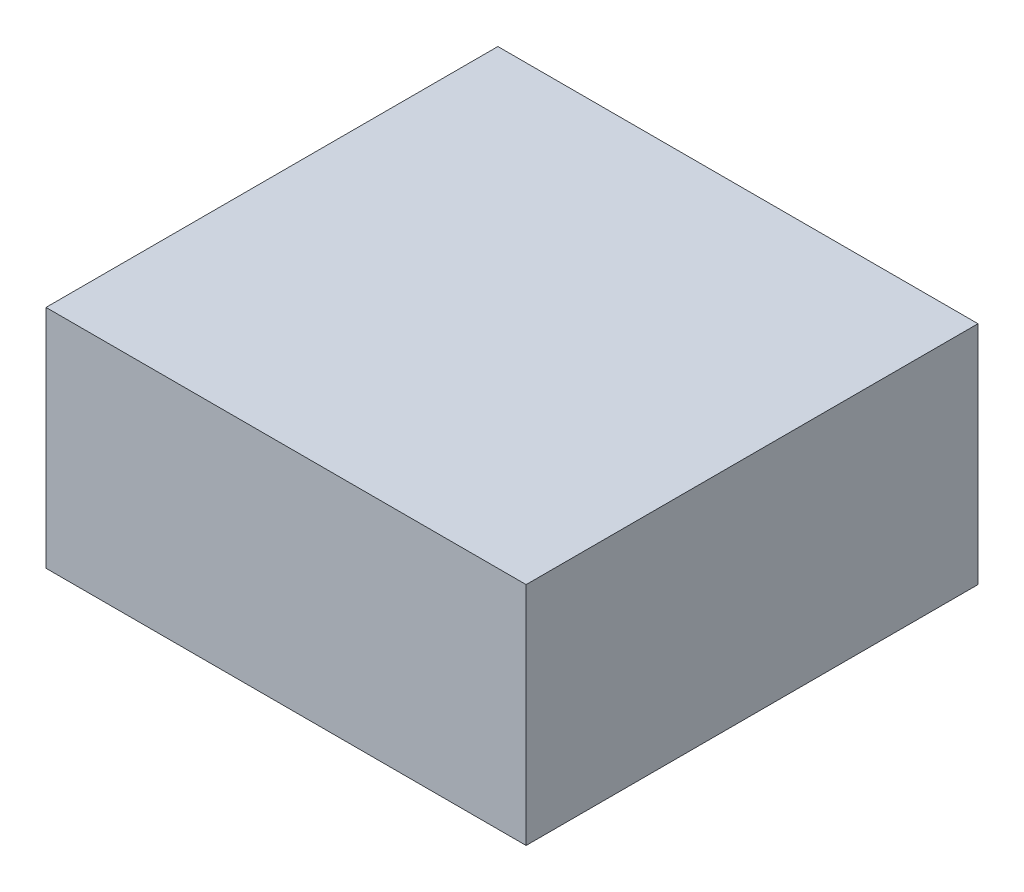
ISO-10303-21;
HEADER;
FILE_DESCRIPTION(('STEP AP214'),'2;1');
FILE_NAME('part.step','',(''),(''),'','','');
FILE_SCHEMA(('AUTOMOTIVE_DESIGN { 1 0 10303 214 1 1 1 1 }'));
ENDSEC;
DATA;
#1=APPLICATION_CONTEXT('core data for automotive mechanical design processes');
#2=APPLICATION_PROTOCOL_DEFINITION('international standard','automotive_design',2000,#1);
#3=PRODUCT_CONTEXT('',#1,'mechanical');
#4=PRODUCT('Part','Part','',(#3));
#5=PRODUCT_RELATED_PRODUCT_CATEGORY('part','',(#4));
#6=PRODUCT_DEFINITION_FORMATION('','',#4);
#7=PRODUCT_DEFINITION_CONTEXT('part definition',#1,'design');
#8=PRODUCT_DEFINITION('design','',#6,#7);
#9=PRODUCT_DEFINITION_SHAPE('','',#8);
#10=(LENGTH_UNIT() NAMED_UNIT(*) SI_UNIT(.MILLI.,.METRE.));
#11=(NAMED_UNIT(*) PLANE_ANGLE_UNIT() SI_UNIT($,.RADIAN.));
#12=(NAMED_UNIT(*) SI_UNIT($,.STERADIAN.) SOLID_ANGLE_UNIT());
#13=UNCERTAINTY_MEASURE_WITH_UNIT(LENGTH_MEASURE(1.E-05),#10,'distance_accuracy_value','');
#14=(GEOMETRIC_REPRESENTATION_CONTEXT(3) GLOBAL_UNCERTAINTY_ASSIGNED_CONTEXT((#13)) GLOBAL_UNIT_ASSIGNED_CONTEXT((#10,
#11,#12)) REPRESENTATION_CONTEXT('',''));
#15=CARTESIAN_POINT('',(0.,0.,0.));
#16=DIRECTION('',(0.,0.,1.));
#17=DIRECTION('',(1.,0.,0.));
#18=AXIS2_PLACEMENT_3D('',#15,#16,#17);
#19=CARTESIAN_POINT('',(-42.5,-20.,80.));
#20=DIRECTION('',(1.,0.,0.));
#21=DIRECTION('',(0.,0.,-1.));
#22=AXIS2_PLACEMENT_3D('',#19,#20,#21);
#23=PLANE('',#22);
#24=DIRECTION('',(0.,-1.,0.));
#25=VECTOR('',#24,1.);
#26=CARTESIAN_POINT('',(-42.5,-20.,0.));
#27=LINE('',#26,#25);
#28=CARTESIAN_POINT('',(-42.5,20.,0.));
#29=VERTEX_POINT('',#28);
#30=CARTESIAN_POINT('',(-42.5,-20.,0.));
#31=VERTEX_POINT('',#30);
#32=EDGE_CURVE('E104',#29,#31,#27,.T.);
#33=ORIENTED_EDGE('',*,*,#32,.T.);
#34=DIRECTION('',(0.,0.,-1.));
#35=VECTOR('',#34,1.);
#36=CARTESIAN_POINT('',(-42.5,-20.,80.));
#37=LINE('',#36,#35);
#38=CARTESIAN_POINT('',(-42.5,-20.,80.));
#39=VERTEX_POINT('',#38);
#40=EDGE_CURVE('E11',#39,#31,#37,.T.);
#41=ORIENTED_EDGE('',*,*,#40,.F.);
#42=DIRECTION('',(0.,-1.,0.));
#43=VECTOR('',#42,1.);
#44=CARTESIAN_POINT('',(-42.5,-20.,80.));
#45=LINE('',#44,#43);
#46=CARTESIAN_POINT('',(-42.5,20.,80.));
#47=VERTEX_POINT('',#46);
#48=EDGE_CURVE('E92',#47,#39,#45,.T.);
#49=ORIENTED_EDGE('',*,*,#48,.F.);
#50=DIRECTION('',(0.,0.,-1.));
#51=VECTOR('',#50,1.);
#52=CARTESIAN_POINT('',(-42.5,20.,80.));
#53=LINE('',#52,#51);
#54=EDGE_CURVE('E100',#47,#29,#53,.T.);
#55=ORIENTED_EDGE('',*,*,#54,.T.);
#56=EDGE_LOOP('',(#33,#41,#49,#55));
#57=FACE_BOUND('',#56,.T.);
#58=ADVANCED_FACE('F41',(#57),#23,.F.);
#59=CARTESIAN_POINT('',(-42.5,-20.,80.));
#60=DIRECTION('',(0.,1.,0.));
#61=DIRECTION('',(0.,0.,1.));
#62=AXIS2_PLACEMENT_3D('',#59,#60,#61);
#63=PLANE('',#62);
#64=DIRECTION('',(1.,0.,0.));
#65=VECTOR('',#64,1.);
#66=CARTESIAN_POINT('',(-42.5,-20.,0.));
#67=LINE('',#66,#65);
#68=CARTESIAN_POINT('',(42.5,-20.,0.));
#69=VERTEX_POINT('',#68);
#70=EDGE_CURVE('E96',#31,#69,#67,.T.);
#71=ORIENTED_EDGE('',*,*,#70,.T.);
#72=DIRECTION('',(0.,0.,-1.));
#73=VECTOR('',#72,1.);
#74=CARTESIAN_POINT('',(42.5,-20.,80.));
#75=LINE('',#74,#73);
#76=CARTESIAN_POINT('',(42.5,-20.,80.));
#77=VERTEX_POINT('',#76);
#78=EDGE_CURVE('E49',#77,#69,#75,.T.);
#79=ORIENTED_EDGE('',*,*,#78,.F.);
#80=DIRECTION('',(1.,0.,0.));
#81=VECTOR('',#80,1.);
#82=CARTESIAN_POINT('',(-42.5,-20.,80.));
#83=LINE('',#82,#81);
#84=EDGE_CURVE('E87',#39,#77,#83,.T.);
#85=ORIENTED_EDGE('',*,*,#84,.F.);
#86=ORIENTED_EDGE('',*,*,#40,.T.);
#87=EDGE_LOOP('',(#71,#79,#85,#86));
#88=FACE_BOUND('',#87,.T.);
#89=ADVANCED_FACE('F95',(#88),#63,.F.);
#90=CARTESIAN_POINT('',(42.5,-20.,80.));
#91=DIRECTION('',(-1.,0.,0.));
#92=DIRECTION('',(0.,0.,1.));
#93=AXIS2_PLACEMENT_3D('',#90,#91,#92);
#94=PLANE('',#93);
#95=DIRECTION('',(0.,1.,0.));
#96=VECTOR('',#95,1.);
#97=CARTESIAN_POINT('',(42.5,-20.,0.));
#98=LINE('',#97,#96);
#99=CARTESIAN_POINT('',(42.5,20.,0.));
#100=VERTEX_POINT('',#99);
#101=EDGE_CURVE('E74',#69,#100,#98,.T.);
#102=ORIENTED_EDGE('',*,*,#101,.T.);
#103=DIRECTION('',(0.,0.,-1.));
#104=VECTOR('',#103,1.);
#105=CARTESIAN_POINT('',(42.5,20.,80.));
#106=LINE('',#105,#104);
#107=CARTESIAN_POINT('',(42.5,20.,80.));
#108=VERTEX_POINT('',#107);
#109=EDGE_CURVE('E97',#108,#100,#106,.T.);
#110=ORIENTED_EDGE('',*,*,#109,.F.);
#111=DIRECTION('',(0.,1.,0.));
#112=VECTOR('',#111,1.);
#113=CARTESIAN_POINT('',(42.5,-20.,80.));
#114=LINE('',#113,#112);
#115=EDGE_CURVE('E90',#77,#108,#114,.T.);
#116=ORIENTED_EDGE('',*,*,#115,.F.);
#117=ORIENTED_EDGE('',*,*,#78,.T.);
#118=EDGE_LOOP('',(#102,#110,#116,#117));
#119=FACE_BOUND('',#118,.T.);
#120=ADVANCED_FACE('F98',(#119),#94,.F.);
#121=CARTESIAN_POINT('',(-42.5,20.,80.));
#122=DIRECTION('',(0.,-1.,0.));
#123=DIRECTION('',(0.,0.,-1.));
#124=AXIS2_PLACEMENT_3D('',#121,#122,#123);
#125=PLANE('',#124);
#126=DIRECTION('',(-1.,0.,0.));
#127=VECTOR('',#126,1.);
#128=CARTESIAN_POINT('',(-42.5,20.,0.));
#129=LINE('',#128,#127);
#130=EDGE_CURVE('E80',#100,#29,#129,.T.);
#131=ORIENTED_EDGE('',*,*,#130,.T.);
#132=ORIENTED_EDGE('',*,*,#54,.F.);
#133=DIRECTION('',(-1.,0.,0.));
#134=VECTOR('',#133,1.);
#135=CARTESIAN_POINT('',(-42.5,20.,80.));
#136=LINE('',#135,#134);
#137=EDGE_CURVE('E57',#108,#47,#136,.T.);
#138=ORIENTED_EDGE('',*,*,#137,.F.);
#139=ORIENTED_EDGE('',*,*,#109,.T.);
#140=EDGE_LOOP('',(#131,#132,#138,#139));
#141=FACE_BOUND('',#140,.T.);
#142=ADVANCED_FACE('F111',(#141),#125,.F.);
#143=CARTESIAN_POINT('',(0.,0.,80.));
#144=DIRECTION('',(0.,0.,-1.));
#145=DIRECTION('',(-1.,0.,0.));
#146=AXIS2_PLACEMENT_3D('',#143,#144,#145);
#147=PLANE('',#146);
#148=ORIENTED_EDGE('',*,*,#48,.T.);
#149=ORIENTED_EDGE('',*,*,#84,.T.);
#150=ORIENTED_EDGE('',*,*,#115,.T.);
#151=ORIENTED_EDGE('',*,*,#137,.T.);
#152=EDGE_LOOP('',(#148,#149,#150,#151));
#153=FACE_BOUND('',#152,.T.);
#154=ADVANCED_FACE('F88',(#153),#147,.F.);
#155=CARTESIAN_POINT('',(0.,0.,0.));
#156=DIRECTION('',(0.,0.,-1.));
#157=DIRECTION('',(-1.,0.,0.));
#158=AXIS2_PLACEMENT_3D('',#155,#156,#157);
#159=PLANE('',#158);
#160=ORIENTED_EDGE('',*,*,#32,.F.);
#161=ORIENTED_EDGE('',*,*,#130,.F.);
#162=ORIENTED_EDGE('',*,*,#101,.F.);
#163=ORIENTED_EDGE('',*,*,#70,.F.);
#164=EDGE_LOOP('',(#160,#161,#162,#163));
#165=FACE_BOUND('',#164,.T.);
#166=ADVANCED_FACE('F114',(#165),#159,.T.);
#167=CLOSED_SHELL('',(#58,#89,#120,#142,#154,#166));
#168=MANIFOLD_SOLID_BREP('B2',#167);
#169=ADVANCED_BREP_SHAPE_REPRESENTATION('',(#18,#168),#14);
#170=SHAPE_DEFINITION_REPRESENTATION(#9,#169);
ENDSEC;
END-ISO-10303-21;
